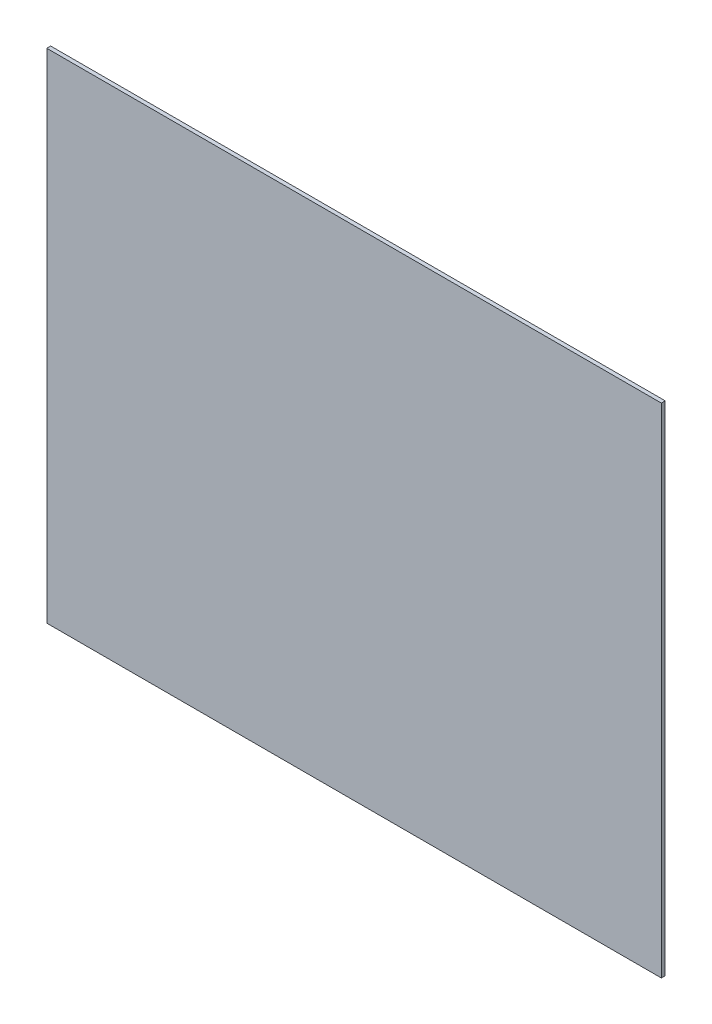
ISO-10303-21;
HEADER;
FILE_DESCRIPTION(('STEP AP214'),'2;1');
FILE_NAME('part.step','',(''),(''),'','','');
FILE_SCHEMA(('AUTOMOTIVE_DESIGN { 1 0 10303 214 1 1 1 1 }'));
ENDSEC;
DATA;
#1=APPLICATION_CONTEXT('core data for automotive mechanical design processes');
#2=APPLICATION_PROTOCOL_DEFINITION('international standard','automotive_design',2000,#1);
#3=PRODUCT_CONTEXT('',#1,'mechanical');
#4=PRODUCT('Part','Part','',(#3));
#5=PRODUCT_RELATED_PRODUCT_CATEGORY('part','',(#4));
#6=PRODUCT_DEFINITION_FORMATION('','',#4);
#7=PRODUCT_DEFINITION_CONTEXT('part definition',#1,'design');
#8=PRODUCT_DEFINITION('design','',#6,#7);
#9=PRODUCT_DEFINITION_SHAPE('','',#8);
#10=(LENGTH_UNIT() NAMED_UNIT(*) SI_UNIT(.MILLI.,.METRE.));
#11=(NAMED_UNIT(*) PLANE_ANGLE_UNIT() SI_UNIT($,.RADIAN.));
#12=(NAMED_UNIT(*) SI_UNIT($,.STERADIAN.) SOLID_ANGLE_UNIT());
#13=UNCERTAINTY_MEASURE_WITH_UNIT(LENGTH_MEASURE(1.E-05),#10,'distance_accuracy_value','');
#14=(GEOMETRIC_REPRESENTATION_CONTEXT(3) GLOBAL_UNCERTAINTY_ASSIGNED_CONTEXT((#13)) GLOBAL_UNIT_ASSIGNED_CONTEXT((#10,
#11,#12)) REPRESENTATION_CONTEXT('',''));
#15=CARTESIAN_POINT('',(0.,0.,0.));
#16=DIRECTION('',(0.,0.,1.));
#17=DIRECTION('',(1.,0.,0.));
#18=AXIS2_PLACEMENT_3D('',#15,#16,#17);
#19=CARTESIAN_POINT('',(125.4125,-50.8,0.79375));
#20=DIRECTION('',(-1.,0.,0.));
#21=DIRECTION('',(0.,-1.,0.));
#22=AXIS2_PLACEMENT_3D('',#19,#20,#21);
#23=PLANE('',#22);
#24=DIRECTION('',(0.,1.,0.));
#25=VECTOR('',#24,1.);
#26=CARTESIAN_POINT('',(125.4125,-50.8,-0.79375));
#27=LINE('',#26,#25);
#28=CARTESIAN_POINT('',(125.4125,-50.8,-0.79375));
#29=VERTEX_POINT('',#28);
#30=CARTESIAN_POINT('',(125.412500000001,152.4,-0.79375));
#31=VERTEX_POINT('',#30);
#32=EDGE_CURVE('E96',#29,#31,#27,.T.);
#33=ORIENTED_EDGE('',*,*,#32,.T.);
#34=DIRECTION('',(0.,0.,-1.));
#35=VECTOR('',#34,1.);
#36=CARTESIAN_POINT('',(125.412500000001,152.4,0.79375));
#37=LINE('',#36,#35);
#38=CARTESIAN_POINT('',(125.412500000001,152.4,0.79375));
#39=VERTEX_POINT('',#38);
#40=EDGE_CURVE('E11',#39,#31,#37,.T.);
#41=ORIENTED_EDGE('',*,*,#40,.F.);
#42=DIRECTION('',(0.,1.,0.));
#43=VECTOR('',#42,1.);
#44=CARTESIAN_POINT('',(125.4125,-50.8,0.79375));
#45=LINE('',#44,#43);
#46=CARTESIAN_POINT('',(125.4125,-50.8,0.79375));
#47=VERTEX_POINT('',#46);
#48=EDGE_CURVE('E84',#47,#39,#45,.T.);
#49=ORIENTED_EDGE('',*,*,#48,.F.);
#50=DIRECTION('',(0.,0.,-1.));
#51=VECTOR('',#50,1.);
#52=CARTESIAN_POINT('',(125.4125,-50.8,0.79375));
#53=LINE('',#52,#51);
#54=EDGE_CURVE('E92',#47,#29,#53,.T.);
#55=ORIENTED_EDGE('',*,*,#54,.T.);
#56=EDGE_LOOP('',(#33,#41,#49,#55));
#57=FACE_BOUND('',#56,.T.);
#58=ADVANCED_FACE('F33',(#57),#23,.F.);
#59=CARTESIAN_POINT('',(-125.412499999999,152.4,0.79375));
#60=DIRECTION('',(0.,-1.,0.));
#61=DIRECTION('',(1.,0.,0.));
#62=AXIS2_PLACEMENT_3D('',#59,#60,#61);
#63=PLANE('',#62);
#64=DIRECTION('',(-1.,0.,0.));
#65=VECTOR('',#64,1.);
#66=CARTESIAN_POINT('',(-125.412499999999,152.4,-0.79375));
#67=LINE('',#66,#65);
#68=CARTESIAN_POINT('',(-125.412499999999,152.4,-0.79375));
#69=VERTEX_POINT('',#68);
#70=EDGE_CURVE('E88',#31,#69,#67,.T.);
#71=ORIENTED_EDGE('',*,*,#70,.T.);
#72=DIRECTION('',(0.,0.,-1.));
#73=VECTOR('',#72,1.);
#74=CARTESIAN_POINT('',(-125.412499999999,152.4,0.79375));
#75=LINE('',#74,#73);
#76=CARTESIAN_POINT('',(-125.412499999999,152.4,0.79375));
#77=VERTEX_POINT('',#76);
#78=EDGE_CURVE('E41',#77,#69,#75,.T.);
#79=ORIENTED_EDGE('',*,*,#78,.F.);
#80=DIRECTION('',(-1.,0.,0.));
#81=VECTOR('',#80,1.);
#82=CARTESIAN_POINT('',(-125.412499999999,152.4,0.79375));
#83=LINE('',#82,#81);
#84=EDGE_CURVE('E79',#39,#77,#83,.T.);
#85=ORIENTED_EDGE('',*,*,#84,.F.);
#86=ORIENTED_EDGE('',*,*,#40,.T.);
#87=EDGE_LOOP('',(#71,#79,#85,#86));
#88=FACE_BOUND('',#87,.T.);
#89=ADVANCED_FACE('F87',(#88),#63,.F.);
#90=CARTESIAN_POINT('',(-125.4125,-50.8,0.79375));
#91=DIRECTION('',(1.,0.,0.));
#92=DIRECTION('',(0.,1.,0.));
#93=AXIS2_PLACEMENT_3D('',#90,#91,#92);
#94=PLANE('',#93);
#95=DIRECTION('',(0.,-1.,0.));
#96=VECTOR('',#95,1.);
#97=CARTESIAN_POINT('',(-125.4125,-50.8,-0.79375));
#98=LINE('',#97,#96);
#99=CARTESIAN_POINT('',(-125.4125,-50.8,-0.79375));
#100=VERTEX_POINT('',#99);
#101=EDGE_CURVE('E66',#69,#100,#98,.T.);
#102=ORIENTED_EDGE('',*,*,#101,.T.);
#103=DIRECTION('',(0.,0.,-1.));
#104=VECTOR('',#103,1.);
#105=CARTESIAN_POINT('',(-125.4125,-50.8,0.79375));
#106=LINE('',#105,#104);
#107=CARTESIAN_POINT('',(-125.4125,-50.8,0.79375));
#108=VERTEX_POINT('',#107);
#109=EDGE_CURVE('E89',#108,#100,#106,.T.);
#110=ORIENTED_EDGE('',*,*,#109,.F.);
#111=DIRECTION('',(0.,-1.,0.));
#112=VECTOR('',#111,1.);
#113=CARTESIAN_POINT('',(-125.4125,-50.8,0.79375));
#114=LINE('',#113,#112);
#115=EDGE_CURVE('E82',#77,#108,#114,.T.);
#116=ORIENTED_EDGE('',*,*,#115,.F.);
#117=ORIENTED_EDGE('',*,*,#78,.T.);
#118=EDGE_LOOP('',(#102,#110,#116,#117));
#119=FACE_BOUND('',#118,.T.);
#120=ADVANCED_FACE('F90',(#119),#94,.F.);
#121=CARTESIAN_POINT('',(-125.4125,-50.8,0.79375));
#122=DIRECTION('',(0.,1.,0.));
#123=DIRECTION('',(-1.,0.,0.));
#124=AXIS2_PLACEMENT_3D('',#121,#122,#123);
#125=PLANE('',#124);
#126=DIRECTION('',(1.,0.,0.));
#127=VECTOR('',#126,1.);
#128=CARTESIAN_POINT('',(-125.4125,-50.8,-0.79375));
#129=LINE('',#128,#127);
#130=EDGE_CURVE('E72',#100,#29,#129,.T.);
#131=ORIENTED_EDGE('',*,*,#130,.T.);
#132=ORIENTED_EDGE('',*,*,#54,.F.);
#133=DIRECTION('',(1.,0.,0.));
#134=VECTOR('',#133,1.);
#135=CARTESIAN_POINT('',(-125.4125,-50.8,0.79375));
#136=LINE('',#135,#134);
#137=EDGE_CURVE('E49',#108,#47,#136,.T.);
#138=ORIENTED_EDGE('',*,*,#137,.F.);
#139=ORIENTED_EDGE('',*,*,#109,.T.);
#140=EDGE_LOOP('',(#131,#132,#138,#139));
#141=FACE_BOUND('',#140,.T.);
#142=ADVANCED_FACE('F103',(#141),#125,.F.);
#143=CARTESIAN_POINT('',(0.,0.,0.79375));
#144=DIRECTION('',(0.,0.,-1.));
#145=DIRECTION('',(-1.,0.,0.));
#146=AXIS2_PLACEMENT_3D('',#143,#144,#145);
#147=PLANE('',#146);
#148=ORIENTED_EDGE('',*,*,#48,.T.);
#149=ORIENTED_EDGE('',*,*,#84,.T.);
#150=ORIENTED_EDGE('',*,*,#115,.T.);
#151=ORIENTED_EDGE('',*,*,#137,.T.);
#152=EDGE_LOOP('',(#148,#149,#150,#151));
#153=FACE_BOUND('',#152,.T.);
#154=ADVANCED_FACE('F80',(#153),#147,.F.);
#155=CARTESIAN_POINT('',(0.,0.,-0.79375));
#156=DIRECTION('',(0.,0.,-1.));
#157=DIRECTION('',(-1.,0.,0.));
#158=AXIS2_PLACEMENT_3D('',#155,#156,#157);
#159=PLANE('',#158);
#160=ORIENTED_EDGE('',*,*,#32,.F.);
#161=ORIENTED_EDGE('',*,*,#130,.F.);
#162=ORIENTED_EDGE('',*,*,#101,.F.);
#163=ORIENTED_EDGE('',*,*,#70,.F.);
#164=EDGE_LOOP('',(#160,#161,#162,#163));
#165=FACE_BOUND('',#164,.T.);
#166=ADVANCED_FACE('F106',(#165),#159,.T.);
#167=CLOSED_SHELL('',(#58,#89,#120,#142,#154,#166));
#168=MANIFOLD_SOLID_BREP('B2',#167);
#169=ADVANCED_BREP_SHAPE_REPRESENTATION('',(#18,#168),#14);
#170=SHAPE_DEFINITION_REPRESENTATION(#9,#169);
ENDSEC;
END-ISO-10303-21;
